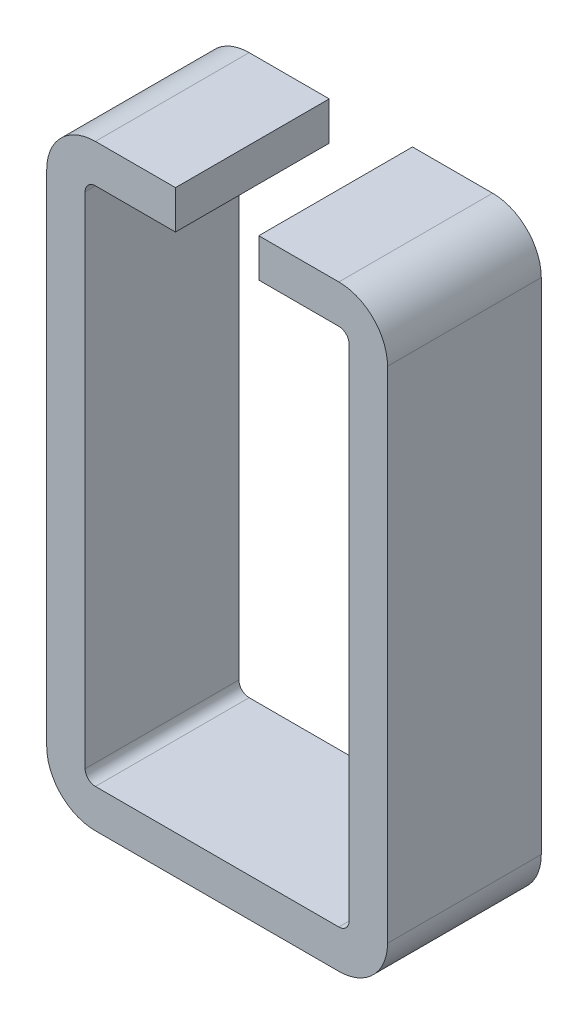
ISO-10303-21;
HEADER;
FILE_DESCRIPTION(('STEP AP214'),'2;1');
FILE_NAME('part.step','',(''),(''),'','','');
FILE_SCHEMA(('AUTOMOTIVE_DESIGN { 1 0 10303 214 1 1 1 1 }'));
ENDSEC;
DATA;
#1=APPLICATION_CONTEXT('core data for automotive mechanical design processes');
#2=APPLICATION_PROTOCOL_DEFINITION('international standard','automotive_design',2000,#1);
#3=PRODUCT_CONTEXT('',#1,'mechanical');
#4=PRODUCT('Part','Part','',(#3));
#5=PRODUCT_RELATED_PRODUCT_CATEGORY('part','',(#4));
#6=PRODUCT_DEFINITION_FORMATION('','',#4);
#7=PRODUCT_DEFINITION_CONTEXT('part definition',#1,'design');
#8=PRODUCT_DEFINITION('design','',#6,#7);
#9=PRODUCT_DEFINITION_SHAPE('','',#8);
#10=(LENGTH_UNIT() NAMED_UNIT(*) SI_UNIT(.MILLI.,.METRE.));
#11=(NAMED_UNIT(*) PLANE_ANGLE_UNIT() SI_UNIT($,.RADIAN.));
#12=(NAMED_UNIT(*) SI_UNIT($,.STERADIAN.) SOLID_ANGLE_UNIT());
#13=UNCERTAINTY_MEASURE_WITH_UNIT(LENGTH_MEASURE(1.E-05),#10,'distance_accuracy_value','');
#14=(GEOMETRIC_REPRESENTATION_CONTEXT(3) GLOBAL_UNCERTAINTY_ASSIGNED_CONTEXT((#13)) GLOBAL_UNIT_ASSIGNED_CONTEXT((#10,
#11,#12)) REPRESENTATION_CONTEXT('',''));
#15=CARTESIAN_POINT('',(0.,0.,0.));
#16=DIRECTION('',(0.,0.,1.));
#17=DIRECTION('',(1.,0.,0.));
#18=AXIS2_PLACEMENT_3D('',#15,#16,#17);
#19=CARTESIAN_POINT('',(-9.5,19.5,-12.));
#20=DIRECTION('',(0.,0.,1.));
#21=DIRECTION('',(1.,0.,0.));
#22=AXIS2_PLACEMENT_3D('',#19,#20,#21);
#23=CYLINDRICAL_SURFACE('',#22,0.800000000000001);
#24=CARTESIAN_POINT('',(-9.5,19.5,0.));
#25=DIRECTION('',(0.,0.,1.));
#26=DIRECTION('',(1.,0.,0.));
#27=AXIS2_PLACEMENT_3D('',#24,#25,#26);
#28=CIRCLE('',#27,0.800000000000001);
#29=CARTESIAN_POINT('',(-9.5,20.3,0.));
#30=VERTEX_POINT('',#29);
#31=CARTESIAN_POINT('',(-10.3,19.5,0.));
#32=VERTEX_POINT('',#31);
#33=EDGE_CURVE('E203',#30,#32,#28,.T.);
#34=ORIENTED_EDGE('',*,*,#33,.T.);
#35=DIRECTION('',(0.,0.,1.));
#36=VECTOR('',#35,1.);
#37=CARTESIAN_POINT('',(-10.3,19.5,-12.));
#38=LINE('',#37,#36);
#39=CARTESIAN_POINT('',(-10.3,19.5,-12.));
#40=VERTEX_POINT('',#39);
#41=EDGE_CURVE('E11',#40,#32,#38,.T.);
#42=ORIENTED_EDGE('',*,*,#41,.F.);
#43=CARTESIAN_POINT('',(-9.5,19.5,-12.));
#44=DIRECTION('',(0.,0.,1.));
#45=DIRECTION('',(1.,0.,0.));
#46=AXIS2_PLACEMENT_3D('',#43,#44,#45);
#47=CIRCLE('',#46,0.800000000000001);
#48=CARTESIAN_POINT('',(-9.5,20.3,-12.));
#49=VERTEX_POINT('',#48);
#50=EDGE_CURVE('E254',#49,#40,#47,.T.);
#51=ORIENTED_EDGE('',*,*,#50,.F.);
#52=DIRECTION('',(0.,0.,1.));
#53=VECTOR('',#52,1.);
#54=CARTESIAN_POINT('',(-9.5,20.3,-12.));
#55=LINE('',#54,#53);
#56=EDGE_CURVE('E38',#49,#30,#55,.T.);
#57=ORIENTED_EDGE('',*,*,#56,.T.);
#58=EDGE_LOOP('',(#34,#42,#51,#57));
#59=FACE_BOUND('',#58,.T.);
#60=ADVANCED_FACE('F35',(#59),#23,.F.);
#61=CARTESIAN_POINT('',(-10.3,0.,-12.));
#62=DIRECTION('',(-1.,0.,0.));
#63=DIRECTION('',(0.,-1.,0.));
#64=AXIS2_PLACEMENT_3D('',#61,#62,#63);
#65=PLANE('',#64);
#66=DIRECTION('',(0.,-1.,0.));
#67=VECTOR('',#66,1.);
#68=CARTESIAN_POINT('',(-10.3,0.,0.));
#69=LINE('',#68,#67);
#70=CARTESIAN_POINT('',(-10.3,-19.5,0.));
#71=VERTEX_POINT('',#70);
#72=EDGE_CURVE('E114',#32,#71,#69,.T.);
#73=ORIENTED_EDGE('',*,*,#72,.T.);
#74=DIRECTION('',(0.,0.,1.));
#75=VECTOR('',#74,1.);
#76=CARTESIAN_POINT('',(-10.3,-19.5,-12.));
#77=LINE('',#76,#75);
#78=CARTESIAN_POINT('',(-10.3,-19.5,-12.));
#79=VERTEX_POINT('',#78);
#80=EDGE_CURVE('E44',#79,#71,#77,.T.);
#81=ORIENTED_EDGE('',*,*,#80,.F.);
#82=DIRECTION('',(0.,-1.,0.));
#83=VECTOR('',#82,1.);
#84=CARTESIAN_POINT('',(-10.3,0.,-12.));
#85=LINE('',#84,#83);
#86=EDGE_CURVE('E52',#40,#79,#85,.T.);
#87=ORIENTED_EDGE('',*,*,#86,.F.);
#88=ORIENTED_EDGE('',*,*,#41,.T.);
#89=EDGE_LOOP('',(#73,#81,#87,#88));
#90=FACE_BOUND('',#89,.T.);
#91=ADVANCED_FACE('F396',(#90),#65,.F.);
#92=CARTESIAN_POINT('',(-9.5,-19.5,-12.));
#93=DIRECTION('',(0.,0.,1.));
#94=DIRECTION('',(1.,0.,0.));
#95=AXIS2_PLACEMENT_3D('',#92,#93,#94);
#96=CYLINDRICAL_SURFACE('',#95,0.799999999999999);
#97=CARTESIAN_POINT('',(-9.5,-19.5,0.));
#98=DIRECTION('',(0.,0.,1.));
#99=DIRECTION('',(1.,0.,0.));
#100=AXIS2_PLACEMENT_3D('',#97,#98,#99);
#101=CIRCLE('',#100,0.799999999999999);
#102=CARTESIAN_POINT('',(-9.5,-20.3,0.));
#103=VERTEX_POINT('',#102);
#104=EDGE_CURVE('E188',#71,#103,#101,.T.);
#105=ORIENTED_EDGE('',*,*,#104,.T.);
#106=DIRECTION('',(0.,0.,1.));
#107=VECTOR('',#106,1.);
#108=CARTESIAN_POINT('',(-9.5,-20.3,-12.));
#109=LINE('',#108,#107);
#110=CARTESIAN_POINT('',(-9.5,-20.3,-12.));
#111=VERTEX_POINT('',#110);
#112=EDGE_CURVE('E186',#111,#103,#109,.T.);
#113=ORIENTED_EDGE('',*,*,#112,.F.);
#114=CARTESIAN_POINT('',(-9.5,-19.5,-12.));
#115=DIRECTION('',(0.,0.,1.));
#116=DIRECTION('',(1.,0.,0.));
#117=AXIS2_PLACEMENT_3D('',#114,#115,#116);
#118=CIRCLE('',#117,0.799999999999999);
#119=EDGE_CURVE('E177',#79,#111,#118,.T.);
#120=ORIENTED_EDGE('',*,*,#119,.F.);
#121=ORIENTED_EDGE('',*,*,#80,.T.);
#122=EDGE_LOOP('',(#105,#113,#120,#121));
#123=FACE_BOUND('',#122,.T.);
#124=ADVANCED_FACE('F187',(#123),#96,.F.);
#125=CARTESIAN_POINT('',(0.,-20.3,-12.));
#126=DIRECTION('',(0.,-1.,0.));
#127=DIRECTION('',(0.,0.,-1.));
#128=AXIS2_PLACEMENT_3D('',#125,#126,#127);
#129=PLANE('',#128);
#130=DIRECTION('',(1.,0.,0.));
#131=VECTOR('',#130,1.);
#132=CARTESIAN_POINT('',(0.,-20.3,0.));
#133=LINE('',#132,#131);
#134=CARTESIAN_POINT('',(9.5,-20.3,0.));
#135=VERTEX_POINT('',#134);
#136=EDGE_CURVE('E251',#103,#135,#133,.T.);
#137=ORIENTED_EDGE('',*,*,#136,.T.);
#138=DIRECTION('',(0.,0.,1.));
#139=VECTOR('',#138,1.);
#140=CARTESIAN_POINT('',(9.5,-20.3,-12.));
#141=LINE('',#140,#139);
#142=CARTESIAN_POINT('',(9.5,-20.3,-12.));
#143=VERTEX_POINT('',#142);
#144=EDGE_CURVE('E191',#143,#135,#141,.T.);
#145=ORIENTED_EDGE('',*,*,#144,.F.);
#146=DIRECTION('',(1.,0.,0.));
#147=VECTOR('',#146,1.);
#148=CARTESIAN_POINT('',(0.,-20.3,-12.));
#149=LINE('',#148,#147);
#150=EDGE_CURVE('E181',#111,#143,#149,.T.);
#151=ORIENTED_EDGE('',*,*,#150,.F.);
#152=ORIENTED_EDGE('',*,*,#112,.T.);
#153=EDGE_LOOP('',(#137,#145,#151,#152));
#154=FACE_BOUND('',#153,.T.);
#155=ADVANCED_FACE('F193',(#154),#129,.F.);
#156=CARTESIAN_POINT('',(9.5,-19.5,-12.));
#157=DIRECTION('',(0.,0.,1.));
#158=DIRECTION('',(1.,0.,0.));
#159=AXIS2_PLACEMENT_3D('',#156,#157,#158);
#160=CYLINDRICAL_SURFACE('',#159,0.800000000000001);
#161=CARTESIAN_POINT('',(9.5,-19.5,0.));
#162=DIRECTION('',(0.,0.,1.));
#163=DIRECTION('',(1.,0.,0.));
#164=AXIS2_PLACEMENT_3D('',#161,#162,#163);
#165=CIRCLE('',#164,0.800000000000001);
#166=CARTESIAN_POINT('',(10.3,-19.5,0.));
#167=VERTEX_POINT('',#166);
#168=EDGE_CURVE('E249',#135,#167,#165,.T.);
#169=ORIENTED_EDGE('',*,*,#168,.T.);
#170=DIRECTION('',(0.,0.,1.));
#171=VECTOR('',#170,1.);
#172=CARTESIAN_POINT('',(10.3,-19.5,-12.));
#173=LINE('',#172,#171);
#174=CARTESIAN_POINT('',(10.3,-19.5,-12.));
#175=VERTEX_POINT('',#174);
#176=EDGE_CURVE('E258',#175,#167,#173,.T.);
#177=ORIENTED_EDGE('',*,*,#176,.F.);
#178=CARTESIAN_POINT('',(9.5,-19.5,-12.));
#179=DIRECTION('',(0.,0.,1.));
#180=DIRECTION('',(1.,0.,0.));
#181=AXIS2_PLACEMENT_3D('',#178,#179,#180);
#182=CIRCLE('',#181,0.800000000000001);
#183=EDGE_CURVE('E196',#143,#175,#182,.T.);
#184=ORIENTED_EDGE('',*,*,#183,.F.);
#185=ORIENTED_EDGE('',*,*,#144,.T.);
#186=EDGE_LOOP('',(#169,#177,#184,#185));
#187=FACE_BOUND('',#186,.T.);
#188=ADVANCED_FACE('F375',(#187),#160,.F.);
#189=CARTESIAN_POINT('',(10.3,0.,-12.));
#190=DIRECTION('',(1.,0.,0.));
#191=DIRECTION('',(0.,1.,0.));
#192=AXIS2_PLACEMENT_3D('',#189,#190,#191);
#193=PLANE('',#192);
#194=DIRECTION('',(0.,1.,0.));
#195=VECTOR('',#194,1.);
#196=CARTESIAN_POINT('',(10.3,0.,0.));
#197=LINE('',#196,#195);
#198=CARTESIAN_POINT('',(10.3,19.5,0.));
#199=VERTEX_POINT('',#198);
#200=EDGE_CURVE('E247',#167,#199,#197,.T.);
#201=ORIENTED_EDGE('',*,*,#200,.T.);
#202=DIRECTION('',(0.,0.,1.));
#203=VECTOR('',#202,1.);
#204=CARTESIAN_POINT('',(10.3,19.5,-12.));
#205=LINE('',#204,#203);
#206=CARTESIAN_POINT('',(10.3,19.5,-12.));
#207=VERTEX_POINT('',#206);
#208=EDGE_CURVE('E261',#207,#199,#205,.T.);
#209=ORIENTED_EDGE('',*,*,#208,.F.);
#210=DIRECTION('',(0.,1.,0.));
#211=VECTOR('',#210,1.);
#212=CARTESIAN_POINT('',(10.3,0.,-12.));
#213=LINE('',#212,#211);
#214=EDGE_CURVE('E198',#175,#207,#213,.T.);
#215=ORIENTED_EDGE('',*,*,#214,.F.);
#216=ORIENTED_EDGE('',*,*,#176,.T.);
#217=EDGE_LOOP('',(#201,#209,#215,#216));
#218=FACE_BOUND('',#217,.T.);
#219=ADVANCED_FACE('F371',(#218),#193,.F.);
#220=CARTESIAN_POINT('',(9.5,19.5,-12.));
#221=DIRECTION('',(0.,0.,1.));
#222=DIRECTION('',(1.,0.,0.));
#223=AXIS2_PLACEMENT_3D('',#220,#221,#222);
#224=CYLINDRICAL_SURFACE('',#223,0.799999999999999);
#225=CARTESIAN_POINT('',(9.5,19.5,0.));
#226=DIRECTION('',(0.,0.,1.));
#227=DIRECTION('',(1.,0.,0.));
#228=AXIS2_PLACEMENT_3D('',#225,#226,#227);
#229=CIRCLE('',#228,0.799999999999999);
#230=CARTESIAN_POINT('',(9.5,20.3,0.));
#231=VERTEX_POINT('',#230);
#232=EDGE_CURVE('E244',#199,#231,#229,.T.);
#233=ORIENTED_EDGE('',*,*,#232,.T.);
#234=DIRECTION('',(0.,0.,1.));
#235=VECTOR('',#234,1.);
#236=CARTESIAN_POINT('',(9.5,20.3,-12.));
#237=LINE('',#236,#235);
#238=CARTESIAN_POINT('',(9.5,20.3,-12.));
#239=VERTEX_POINT('',#238);
#240=EDGE_CURVE('E264',#239,#231,#237,.T.);
#241=ORIENTED_EDGE('',*,*,#240,.F.);
#242=CARTESIAN_POINT('',(9.5,19.5,-12.));
#243=DIRECTION('',(0.,0.,1.));
#244=DIRECTION('',(1.,0.,0.));
#245=AXIS2_PLACEMENT_3D('',#242,#243,#244);
#246=CIRCLE('',#245,0.799999999999999);
#247=EDGE_CURVE('E376',#207,#239,#246,.T.);
#248=ORIENTED_EDGE('',*,*,#247,.F.);
#249=ORIENTED_EDGE('',*,*,#208,.T.);
#250=EDGE_LOOP('',(#233,#241,#248,#249));
#251=FACE_BOUND('',#250,.T.);
#252=ADVANCED_FACE('F366',(#251),#224,.F.);
#253=CARTESIAN_POINT('',(0.,20.3,-12.));
#254=DIRECTION('',(0.,-1.,0.));
#255=DIRECTION('',(0.,0.,-1.));
#256=AXIS2_PLACEMENT_3D('',#253,#254,#255);
#257=PLANE('',#256);
#258=DIRECTION('',(1.,0.,0.));
#259=VECTOR('',#258,1.);
#260=CARTESIAN_POINT('',(0.,20.3,0.));
#261=LINE('',#260,#259);
#262=CARTESIAN_POINT('',(3.25000000000006,20.3,0.));
#263=VERTEX_POINT('',#262);
#264=EDGE_CURVE('E241',#263,#231,#261,.T.);
#265=ORIENTED_EDGE('',*,*,#264,.F.);
#266=DIRECTION('',(0.,0.,1.));
#267=VECTOR('',#266,1.);
#268=CARTESIAN_POINT('',(3.25000000000006,20.3,-12.));
#269=LINE('',#268,#267);
#270=CARTESIAN_POINT('',(3.25000000000006,20.3,-12.));
#271=VERTEX_POINT('',#270);
#272=EDGE_CURVE('E266',#271,#263,#269,.T.);
#273=ORIENTED_EDGE('',*,*,#272,.F.);
#274=DIRECTION('',(1.,0.,0.));
#275=VECTOR('',#274,1.);
#276=CARTESIAN_POINT('',(0.,20.3,-12.));
#277=LINE('',#276,#275);
#278=EDGE_CURVE('E363',#271,#239,#277,.T.);
#279=ORIENTED_EDGE('',*,*,#278,.T.);
#280=ORIENTED_EDGE('',*,*,#240,.T.);
#281=EDGE_LOOP('',(#265,#273,#279,#280));
#282=FACE_BOUND('',#281,.T.);
#283=ADVANCED_FACE('F361',(#282),#257,.T.);
#284=CARTESIAN_POINT('',(3.25000000000006,0.,-12.));
#285=DIRECTION('',(-1.,0.,0.));
#286=DIRECTION('',(0.,-1.,0.));
#287=AXIS2_PLACEMENT_3D('',#284,#285,#286);
#288=PLANE('',#287);
#289=DIRECTION('',(0.,-1.,0.));
#290=VECTOR('',#289,1.);
#291=CARTESIAN_POINT('',(3.25000000000006,0.,0.));
#292=LINE('',#291,#290);
#293=CARTESIAN_POINT('',(3.25000000000006,23.3,0.));
#294=VERTEX_POINT('',#293);
#295=EDGE_CURVE('E238',#294,#263,#292,.T.);
#296=ORIENTED_EDGE('',*,*,#295,.F.);
#297=DIRECTION('',(0.,0.,1.));
#298=VECTOR('',#297,1.);
#299=CARTESIAN_POINT('',(3.25000000000006,23.3,-12.));
#300=LINE('',#299,#298);
#301=CARTESIAN_POINT('',(3.25000000000006,23.3,-12.));
#302=VERTEX_POINT('',#301);
#303=EDGE_CURVE('E268',#302,#294,#300,.T.);
#304=ORIENTED_EDGE('',*,*,#303,.F.);
#305=DIRECTION('',(0.,-1.,0.));
#306=VECTOR('',#305,1.);
#307=CARTESIAN_POINT('',(3.25000000000006,0.,-12.));
#308=LINE('',#307,#306);
#309=EDGE_CURVE('E357',#302,#271,#308,.T.);
#310=ORIENTED_EDGE('',*,*,#309,.T.);
#311=ORIENTED_EDGE('',*,*,#272,.T.);
#312=EDGE_LOOP('',(#296,#304,#310,#311));
#313=FACE_BOUND('',#312,.T.);
#314=ADVANCED_FACE('F354',(#313),#288,.T.);
#315=CARTESIAN_POINT('',(0.,23.3,-12.));
#316=DIRECTION('',(0.,1.,0.));
#317=DIRECTION('',(-1.,0.,0.));
#318=AXIS2_PLACEMENT_3D('',#315,#316,#317);
#319=PLANE('',#318);
#320=DIRECTION('',(-1.,0.,0.));
#321=VECTOR('',#320,1.);
#322=CARTESIAN_POINT('',(0.,23.3,0.));
#323=LINE('',#322,#321);
#324=CARTESIAN_POINT('',(9.5,23.3,0.));
#325=VERTEX_POINT('',#324);
#326=EDGE_CURVE('E235',#325,#294,#323,.T.);
#327=ORIENTED_EDGE('',*,*,#326,.F.);
#328=DIRECTION('',(0.,0.,1.));
#329=VECTOR('',#328,1.);
#330=CARTESIAN_POINT('',(9.5,23.3,-12.));
#331=LINE('',#330,#329);
#332=CARTESIAN_POINT('',(9.5,23.3,-12.));
#333=VERTEX_POINT('',#332);
#334=EDGE_CURVE('E270',#333,#325,#331,.T.);
#335=ORIENTED_EDGE('',*,*,#334,.F.);
#336=DIRECTION('',(-1.,0.,0.));
#337=VECTOR('',#336,1.);
#338=CARTESIAN_POINT('',(0.,23.3,-12.));
#339=LINE('',#338,#337);
#340=EDGE_CURVE('E381',#333,#302,#339,.T.);
#341=ORIENTED_EDGE('',*,*,#340,.T.);
#342=ORIENTED_EDGE('',*,*,#303,.T.);
#343=EDGE_LOOP('',(#327,#335,#341,#342));
#344=FACE_BOUND('',#343,.T.);
#345=ADVANCED_FACE('F349',(#344),#319,.T.);
#346=CARTESIAN_POINT('',(9.5,19.5,-12.));
#347=DIRECTION('',(0.,0.,1.));
#348=DIRECTION('',(1.,0.,0.));
#349=AXIS2_PLACEMENT_3D('',#346,#347,#348);
#350=CYLINDRICAL_SURFACE('',#349,3.8);
#351=CARTESIAN_POINT('',(9.5,19.5,0.));
#352=DIRECTION('',(0.,0.,1.));
#353=DIRECTION('',(1.,0.,0.));
#354=AXIS2_PLACEMENT_3D('',#351,#352,#353);
#355=CIRCLE('',#354,3.8);
#356=CARTESIAN_POINT('',(13.3,19.5,0.));
#357=VERTEX_POINT('',#356);
#358=EDGE_CURVE('E232',#357,#325,#355,.T.);
#359=ORIENTED_EDGE('',*,*,#358,.F.);
#360=DIRECTION('',(0.,0.,1.));
#361=VECTOR('',#360,1.);
#362=CARTESIAN_POINT('',(13.3,19.5,-12.));
#363=LINE('',#362,#361);
#364=CARTESIAN_POINT('',(13.3,19.5,-12.));
#365=VERTEX_POINT('',#364);
#366=EDGE_CURVE('E272',#365,#357,#363,.T.);
#367=ORIENTED_EDGE('',*,*,#366,.F.);
#368=CARTESIAN_POINT('',(9.5,19.5,-12.));
#369=DIRECTION('',(0.,0.,1.));
#370=DIRECTION('',(1.,0.,0.));
#371=AXIS2_PLACEMENT_3D('',#368,#369,#370);
#372=CIRCLE('',#371,3.8);
#373=EDGE_CURVE('E345',#365,#333,#372,.T.);
#374=ORIENTED_EDGE('',*,*,#373,.T.);
#375=ORIENTED_EDGE('',*,*,#334,.T.);
#376=EDGE_LOOP('',(#359,#367,#374,#375));
#377=FACE_BOUND('',#376,.T.);
#378=ADVANCED_FACE('F343',(#377),#350,.T.);
#379=CARTESIAN_POINT('',(13.3,0.,-12.));
#380=DIRECTION('',(1.,0.,0.));
#381=DIRECTION('',(0.,0.,-1.));
#382=AXIS2_PLACEMENT_3D('',#379,#380,#381);
#383=PLANE('',#382);
#384=DIRECTION('',(0.,1.,0.));
#385=VECTOR('',#384,1.);
#386=CARTESIAN_POINT('',(13.3,0.,0.));
#387=LINE('',#386,#385);
#388=CARTESIAN_POINT('',(13.3,-19.5,0.));
#389=VERTEX_POINT('',#388);
#390=EDGE_CURVE('E229',#389,#357,#387,.T.);
#391=ORIENTED_EDGE('',*,*,#390,.F.);
#392=DIRECTION('',(0.,0.,1.));
#393=VECTOR('',#392,1.);
#394=CARTESIAN_POINT('',(13.3,-19.5,-12.));
#395=LINE('',#394,#393);
#396=CARTESIAN_POINT('',(13.3,-19.5,-12.));
#397=VERTEX_POINT('',#396);
#398=EDGE_CURVE('E274',#397,#389,#395,.T.);
#399=ORIENTED_EDGE('',*,*,#398,.F.);
#400=DIRECTION('',(0.,1.,0.));
#401=VECTOR('',#400,1.);
#402=CARTESIAN_POINT('',(13.3,0.,-12.));
#403=LINE('',#402,#401);
#404=EDGE_CURVE('E339',#397,#365,#403,.T.);
#405=ORIENTED_EDGE('',*,*,#404,.T.);
#406=ORIENTED_EDGE('',*,*,#366,.T.);
#407=EDGE_LOOP('',(#391,#399,#405,#406));
#408=FACE_BOUND('',#407,.T.);
#409=ADVANCED_FACE('F336',(#408),#383,.T.);
#410=CARTESIAN_POINT('',(9.5,-19.5,-12.));
#411=DIRECTION('',(0.,0.,1.));
#412=DIRECTION('',(1.,0.,0.));
#413=AXIS2_PLACEMENT_3D('',#410,#411,#412);
#414=CYLINDRICAL_SURFACE('',#413,3.8);
#415=CARTESIAN_POINT('',(9.5,-19.5,0.));
#416=DIRECTION('',(0.,0.,1.));
#417=DIRECTION('',(1.,0.,0.));
#418=AXIS2_PLACEMENT_3D('',#415,#416,#417);
#419=CIRCLE('',#418,3.8);
#420=CARTESIAN_POINT('',(9.5,-23.3,0.));
#421=VERTEX_POINT('',#420);
#422=EDGE_CURVE('E226',#421,#389,#419,.T.);
#423=ORIENTED_EDGE('',*,*,#422,.F.);
#424=DIRECTION('',(0.,0.,1.));
#425=VECTOR('',#424,1.);
#426=CARTESIAN_POINT('',(9.5,-23.3,-12.));
#427=LINE('',#426,#425);
#428=CARTESIAN_POINT('',(9.5,-23.3,-12.));
#429=VERTEX_POINT('',#428);
#430=EDGE_CURVE('E276',#429,#421,#427,.T.);
#431=ORIENTED_EDGE('',*,*,#430,.F.);
#432=CARTESIAN_POINT('',(9.5,-19.5,-12.));
#433=DIRECTION('',(0.,0.,1.));
#434=DIRECTION('',(1.,0.,0.));
#435=AXIS2_PLACEMENT_3D('',#432,#433,#434);
#436=CIRCLE('',#435,3.8);
#437=EDGE_CURVE('E385',#429,#397,#436,.T.);
#438=ORIENTED_EDGE('',*,*,#437,.T.);
#439=ORIENTED_EDGE('',*,*,#398,.T.);
#440=EDGE_LOOP('',(#423,#431,#438,#439));
#441=FACE_BOUND('',#440,.T.);
#442=ADVANCED_FACE('F332',(#441),#414,.T.);
#443=CARTESIAN_POINT('',(0.,-23.3,-12.));
#444=DIRECTION('',(0.,-1.,0.));
#445=DIRECTION('',(1.,0.,0.));
#446=AXIS2_PLACEMENT_3D('',#443,#444,#445);
#447=PLANE('',#446);
#448=DIRECTION('',(1.,0.,0.));
#449=VECTOR('',#448,1.);
#450=CARTESIAN_POINT('',(0.,-23.3,0.));
#451=LINE('',#450,#449);
#452=CARTESIAN_POINT('',(-9.5,-23.3,0.));
#453=VERTEX_POINT('',#452);
#454=EDGE_CURVE('E223',#453,#421,#451,.T.);
#455=ORIENTED_EDGE('',*,*,#454,.F.);
#456=DIRECTION('',(0.,0.,1.));
#457=VECTOR('',#456,1.);
#458=CARTESIAN_POINT('',(-9.5,-23.3,-12.));
#459=LINE('',#458,#457);
#460=CARTESIAN_POINT('',(-9.5,-23.3,-12.));
#461=VERTEX_POINT('',#460);
#462=EDGE_CURVE('E278',#461,#453,#459,.T.);
#463=ORIENTED_EDGE('',*,*,#462,.F.);
#464=DIRECTION('',(1.,0.,0.));
#465=VECTOR('',#464,1.);
#466=CARTESIAN_POINT('',(0.,-23.3,-12.));
#467=LINE('',#466,#465);
#468=EDGE_CURVE('E328',#461,#429,#467,.T.);
#469=ORIENTED_EDGE('',*,*,#468,.T.);
#470=ORIENTED_EDGE('',*,*,#430,.T.);
#471=EDGE_LOOP('',(#455,#463,#469,#470));
#472=FACE_BOUND('',#471,.T.);
#473=ADVANCED_FACE('F326',(#472),#447,.T.);
#474=CARTESIAN_POINT('',(-9.5,-19.5,-12.));
#475=DIRECTION('',(0.,0.,1.));
#476=DIRECTION('',(1.,0.,0.));
#477=AXIS2_PLACEMENT_3D('',#474,#475,#476);
#478=CYLINDRICAL_SURFACE('',#477,3.8);
#479=CARTESIAN_POINT('',(-9.5,-19.5,0.));
#480=DIRECTION('',(0.,0.,1.));
#481=DIRECTION('',(1.,0.,0.));
#482=AXIS2_PLACEMENT_3D('',#479,#480,#481);
#483=CIRCLE('',#482,3.8);
#484=CARTESIAN_POINT('',(-13.3,-19.5,0.));
#485=VERTEX_POINT('',#484);
#486=EDGE_CURVE('E220',#485,#453,#483,.T.);
#487=ORIENTED_EDGE('',*,*,#486,.F.);
#488=DIRECTION('',(0.,0.,1.));
#489=VECTOR('',#488,1.);
#490=CARTESIAN_POINT('',(-13.3,-19.5,-12.));
#491=LINE('',#490,#489);
#492=CARTESIAN_POINT('',(-13.3,-19.5,-12.));
#493=VERTEX_POINT('',#492);
#494=EDGE_CURVE('E280',#493,#485,#491,.T.);
#495=ORIENTED_EDGE('',*,*,#494,.F.);
#496=CARTESIAN_POINT('',(-9.5,-19.5,-12.));
#497=DIRECTION('',(0.,0.,1.));
#498=DIRECTION('',(1.,0.,0.));
#499=AXIS2_PLACEMENT_3D('',#496,#497,#498);
#500=CIRCLE('',#499,3.8);
#501=EDGE_CURVE('E322',#493,#461,#500,.T.);
#502=ORIENTED_EDGE('',*,*,#501,.T.);
#503=ORIENTED_EDGE('',*,*,#462,.T.);
#504=EDGE_LOOP('',(#487,#495,#502,#503));
#505=FACE_BOUND('',#504,.T.);
#506=ADVANCED_FACE('F319',(#505),#478,.T.);
#507=CARTESIAN_POINT('',(-13.3,0.,-12.));
#508=DIRECTION('',(-1.,0.,0.));
#509=DIRECTION('',(0.,0.,1.));
#510=AXIS2_PLACEMENT_3D('',#507,#508,#509);
#511=PLANE('',#510);
#512=DIRECTION('',(0.,-1.,0.));
#513=VECTOR('',#512,1.);
#514=CARTESIAN_POINT('',(-13.3,0.,0.));
#515=LINE('',#514,#513);
#516=CARTESIAN_POINT('',(-13.3,19.5,0.));
#517=VERTEX_POINT('',#516);
#518=EDGE_CURVE('E217',#517,#485,#515,.T.);
#519=ORIENTED_EDGE('',*,*,#518,.F.);
#520=DIRECTION('',(0.,0.,1.));
#521=VECTOR('',#520,1.);
#522=CARTESIAN_POINT('',(-13.3,19.5,-12.));
#523=LINE('',#522,#521);
#524=CARTESIAN_POINT('',(-13.3,19.5,-12.));
#525=VERTEX_POINT('',#524);
#526=EDGE_CURVE('E282',#525,#517,#523,.T.);
#527=ORIENTED_EDGE('',*,*,#526,.F.);
#528=DIRECTION('',(0.,-1.,0.));
#529=VECTOR('',#528,1.);
#530=CARTESIAN_POINT('',(-13.3,0.,-12.));
#531=LINE('',#530,#529);
#532=EDGE_CURVE('E389',#525,#493,#531,.T.);
#533=ORIENTED_EDGE('',*,*,#532,.T.);
#534=ORIENTED_EDGE('',*,*,#494,.T.);
#535=EDGE_LOOP('',(#519,#527,#533,#534));
#536=FACE_BOUND('',#535,.T.);
#537=ADVANCED_FACE('F315',(#536),#511,.T.);
#538=CARTESIAN_POINT('',(-9.5,19.5,-12.));
#539=DIRECTION('',(0.,0.,1.));
#540=DIRECTION('',(1.,0.,0.));
#541=AXIS2_PLACEMENT_3D('',#538,#539,#540);
#542=CYLINDRICAL_SURFACE('',#541,3.8);
#543=CARTESIAN_POINT('',(-9.5,19.5,0.));
#544=DIRECTION('',(0.,0.,1.));
#545=DIRECTION('',(1.,0.,0.));
#546=AXIS2_PLACEMENT_3D('',#543,#544,#545);
#547=CIRCLE('',#546,3.8);
#548=CARTESIAN_POINT('',(-9.5,23.3,0.));
#549=VERTEX_POINT('',#548);
#550=EDGE_CURVE('E214',#549,#517,#547,.T.);
#551=ORIENTED_EDGE('',*,*,#550,.F.);
#552=DIRECTION('',(0.,0.,1.));
#553=VECTOR('',#552,1.);
#554=CARTESIAN_POINT('',(-9.5,23.3,-12.));
#555=LINE('',#554,#553);
#556=CARTESIAN_POINT('',(-9.5,23.3,-12.));
#557=VERTEX_POINT('',#556);
#558=EDGE_CURVE('E284',#557,#549,#555,.T.);
#559=ORIENTED_EDGE('',*,*,#558,.F.);
#560=CARTESIAN_POINT('',(-9.5,19.5,-12.));
#561=DIRECTION('',(0.,0.,1.));
#562=DIRECTION('',(1.,0.,0.));
#563=AXIS2_PLACEMENT_3D('',#560,#561,#562);
#564=CIRCLE('',#563,3.8);
#565=EDGE_CURVE('E311',#557,#525,#564,.T.);
#566=ORIENTED_EDGE('',*,*,#565,.T.);
#567=ORIENTED_EDGE('',*,*,#526,.T.);
#568=EDGE_LOOP('',(#551,#559,#566,#567));
#569=FACE_BOUND('',#568,.T.);
#570=ADVANCED_FACE('F307',(#569),#542,.T.);
#571=CARTESIAN_POINT('',(0.,23.3,-12.));
#572=DIRECTION('',(0.,-1.,0.));
#573=DIRECTION('',(1.,0.,0.));
#574=AXIS2_PLACEMENT_3D('',#571,#572,#573);
#575=PLANE('',#574);
#576=DIRECTION('',(1.,0.,0.));
#577=VECTOR('',#576,1.);
#578=CARTESIAN_POINT('',(0.,23.3,0.));
#579=LINE('',#578,#577);
#580=CARTESIAN_POINT('',(-3.24999999999994,23.3,0.));
#581=VERTEX_POINT('',#580);
#582=EDGE_CURVE('E211',#549,#581,#579,.T.);
#583=ORIENTED_EDGE('',*,*,#582,.T.);
#584=DIRECTION('',(0.,0.,1.));
#585=VECTOR('',#584,1.);
#586=CARTESIAN_POINT('',(-3.24999999999994,23.3,-12.));
#587=LINE('',#586,#585);
#588=CARTESIAN_POINT('',(-3.24999999999994,23.3,-12.));
#589=VERTEX_POINT('',#588);
#590=EDGE_CURVE('E286',#589,#581,#587,.T.);
#591=ORIENTED_EDGE('',*,*,#590,.F.);
#592=DIRECTION('',(1.,0.,0.));
#593=VECTOR('',#592,1.);
#594=CARTESIAN_POINT('',(0.,23.3,-12.));
#595=LINE('',#594,#593);
#596=EDGE_CURVE('E392',#557,#589,#595,.T.);
#597=ORIENTED_EDGE('',*,*,#596,.F.);
#598=ORIENTED_EDGE('',*,*,#558,.T.);
#599=EDGE_LOOP('',(#583,#591,#597,#598));
#600=FACE_BOUND('',#599,.T.);
#601=ADVANCED_FACE('F304',(#600),#575,.F.);
#602=CARTESIAN_POINT('',(-3.24999999999994,0.,-12.));
#603=DIRECTION('',(1.,0.,0.));
#604=DIRECTION('',(0.,0.,-1.));
#605=AXIS2_PLACEMENT_3D('',#602,#603,#604);
#606=PLANE('',#605);
#607=DIRECTION('',(0.,1.,0.));
#608=VECTOR('',#607,1.);
#609=CARTESIAN_POINT('',(-3.24999999999994,0.,0.));
#610=LINE('',#609,#608);
#611=CARTESIAN_POINT('',(-3.24999999999994,20.3,0.));
#612=VERTEX_POINT('',#611);
#613=EDGE_CURVE('E208',#612,#581,#610,.T.);
#614=ORIENTED_EDGE('',*,*,#613,.F.);
#615=DIRECTION('',(0.,0.,1.));
#616=VECTOR('',#615,1.);
#617=CARTESIAN_POINT('',(-3.24999999999994,20.3,-12.));
#618=LINE('',#617,#616);
#619=CARTESIAN_POINT('',(-3.24999999999994,20.3,-12.));
#620=VERTEX_POINT('',#619);
#621=EDGE_CURVE('E287',#620,#612,#618,.T.);
#622=ORIENTED_EDGE('',*,*,#621,.F.);
#623=DIRECTION('',(0.,1.,0.));
#624=VECTOR('',#623,1.);
#625=CARTESIAN_POINT('',(-3.24999999999994,0.,-12.));
#626=LINE('',#625,#624);
#627=EDGE_CURVE('E301',#620,#589,#626,.T.);
#628=ORIENTED_EDGE('',*,*,#627,.T.);
#629=ORIENTED_EDGE('',*,*,#590,.T.);
#630=EDGE_LOOP('',(#614,#622,#628,#629));
#631=FACE_BOUND('',#630,.T.);
#632=ADVANCED_FACE('F298',(#631),#606,.T.);
#633=CARTESIAN_POINT('',(0.,20.3,-12.));
#634=DIRECTION('',(0.,1.,0.));
#635=DIRECTION('',(0.,0.,1.));
#636=AXIS2_PLACEMENT_3D('',#633,#634,#635);
#637=PLANE('',#636);
#638=DIRECTION('',(-1.,0.,0.));
#639=VECTOR('',#638,1.);
#640=CARTESIAN_POINT('',(0.,20.3,0.));
#641=LINE('',#640,#639);
#642=EDGE_CURVE('E206',#612,#30,#641,.T.);
#643=ORIENTED_EDGE('',*,*,#642,.T.);
#644=ORIENTED_EDGE('',*,*,#56,.F.);
#645=DIRECTION('',(-1.,0.,0.));
#646=VECTOR('',#645,1.);
#647=CARTESIAN_POINT('',(0.,20.3,-12.));
#648=LINE('',#647,#646);
#649=EDGE_CURVE('E126',#620,#49,#648,.T.);
#650=ORIENTED_EDGE('',*,*,#649,.F.);
#651=ORIENTED_EDGE('',*,*,#621,.T.);
#652=EDGE_LOOP('',(#643,#644,#650,#651));
#653=FACE_BOUND('',#652,.T.);
#654=ADVANCED_FACE('F438',(#653),#637,.F.);
#655=CARTESIAN_POINT('',(0.,0.,-12.));
#656=DIRECTION('',(0.,0.,1.));
#657=DIRECTION('',(1.,0.,0.));
#658=AXIS2_PLACEMENT_3D('',#655,#656,#657);
#659=PLANE('',#658);
#660=ORIENTED_EDGE('',*,*,#50,.T.);
#661=ORIENTED_EDGE('',*,*,#86,.T.);
#662=ORIENTED_EDGE('',*,*,#119,.T.);
#663=ORIENTED_EDGE('',*,*,#150,.T.);
#664=ORIENTED_EDGE('',*,*,#183,.T.);
#665=ORIENTED_EDGE('',*,*,#214,.T.);
#666=ORIENTED_EDGE('',*,*,#247,.T.);
#667=ORIENTED_EDGE('',*,*,#278,.F.);
#668=ORIENTED_EDGE('',*,*,#309,.F.);
#669=ORIENTED_EDGE('',*,*,#340,.F.);
#670=ORIENTED_EDGE('',*,*,#373,.F.);
#671=ORIENTED_EDGE('',*,*,#404,.F.);
#672=ORIENTED_EDGE('',*,*,#437,.F.);
#673=ORIENTED_EDGE('',*,*,#468,.F.);
#674=ORIENTED_EDGE('',*,*,#501,.F.);
#675=ORIENTED_EDGE('',*,*,#532,.F.);
#676=ORIENTED_EDGE('',*,*,#565,.F.);
#677=ORIENTED_EDGE('',*,*,#596,.T.);
#678=ORIENTED_EDGE('',*,*,#627,.F.);
#679=ORIENTED_EDGE('',*,*,#649,.T.);
#680=EDGE_LOOP('',(#660,#661,#662,#663,#664,#665,#666,#667,#668,#669,#670,#671,#672,#673,#674,
#675,#676,#677,#678,#679));
#681=FACE_BOUND('',#680,.T.);
#682=ADVANCED_FACE('F179',(#681),#659,.F.);
#683=CARTESIAN_POINT('',(0.,0.,0.));
#684=DIRECTION('',(0.,0.,1.));
#685=DIRECTION('',(1.,0.,0.));
#686=AXIS2_PLACEMENT_3D('',#683,#684,#685);
#687=PLANE('',#686);
#688=ORIENTED_EDGE('',*,*,#33,.F.);
#689=ORIENTED_EDGE('',*,*,#642,.F.);
#690=ORIENTED_EDGE('',*,*,#613,.T.);
#691=ORIENTED_EDGE('',*,*,#582,.F.);
#692=ORIENTED_EDGE('',*,*,#550,.T.);
#693=ORIENTED_EDGE('',*,*,#518,.T.);
#694=ORIENTED_EDGE('',*,*,#486,.T.);
#695=ORIENTED_EDGE('',*,*,#454,.T.);
#696=ORIENTED_EDGE('',*,*,#422,.T.);
#697=ORIENTED_EDGE('',*,*,#390,.T.);
#698=ORIENTED_EDGE('',*,*,#358,.T.);
#699=ORIENTED_EDGE('',*,*,#326,.T.);
#700=ORIENTED_EDGE('',*,*,#295,.T.);
#701=ORIENTED_EDGE('',*,*,#264,.T.);
#702=ORIENTED_EDGE('',*,*,#232,.F.);
#703=ORIENTED_EDGE('',*,*,#200,.F.);
#704=ORIENTED_EDGE('',*,*,#168,.F.);
#705=ORIENTED_EDGE('',*,*,#136,.F.);
#706=ORIENTED_EDGE('',*,*,#104,.F.);
#707=ORIENTED_EDGE('',*,*,#72,.F.);
#708=EDGE_LOOP('',(#688,#689,#690,#691,#692,#693,#694,#695,#696,#697,#698,#699,#700,#701,#702,
#703,#704,#705,#706,#707));
#709=FACE_BOUND('',#708,.T.);
#710=ADVANCED_FACE('F294',(#709),#687,.T.);
#711=CLOSED_SHELL('',(#60,#91,#124,#155,#188,#219,#252,#283,#314,#345,#378,#409,#442,#473,#506,
#537,#570,#601,#632,#654,#682,#710));
#712=MANIFOLD_SOLID_BREP('B2',#711);
#713=ADVANCED_BREP_SHAPE_REPRESENTATION('',(#18,#712),#14);
#714=SHAPE_DEFINITION_REPRESENTATION(#9,#713);
ENDSEC;
END-ISO-10303-21;
